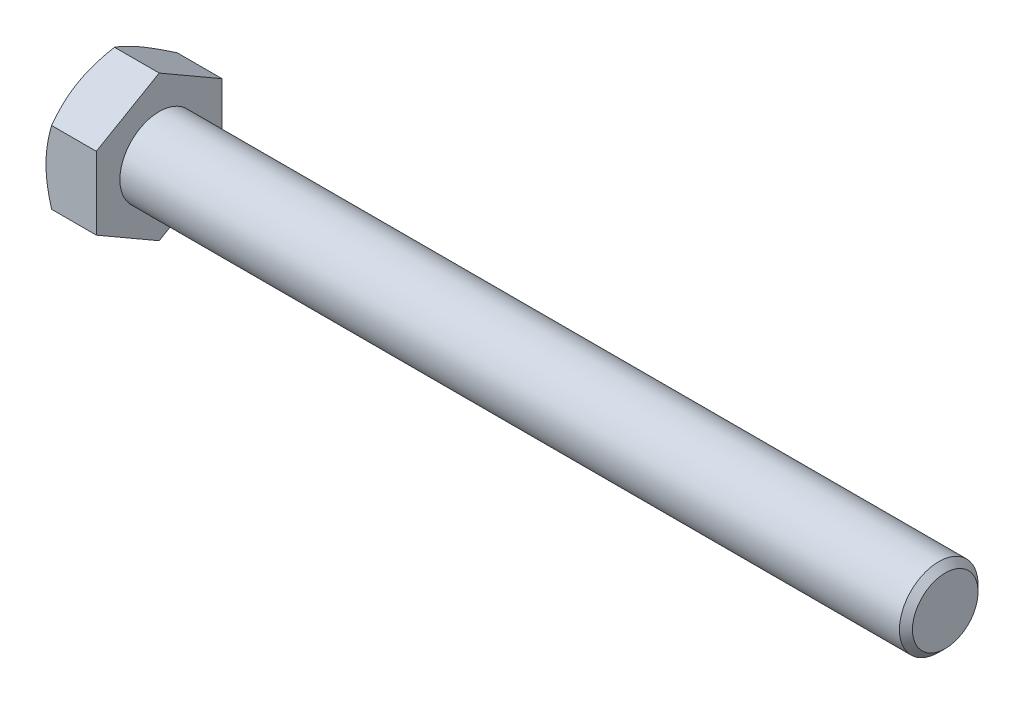
ISO-10303-21;
HEADER;
FILE_DESCRIPTION(('STEP AP214'),'2;1');
FILE_NAME('part.step','',(''),(''),'','','');
FILE_SCHEMA(('AUTOMOTIVE_DESIGN { 1 0 10303 214 1 1 1 1 }'));
ENDSEC;
DATA;
#1=APPLICATION_CONTEXT('core data for automotive mechanical design processes');
#2=APPLICATION_PROTOCOL_DEFINITION('international standard','automotive_design',2000,#1);
#3=PRODUCT_CONTEXT('',#1,'mechanical');
#4=PRODUCT('Part','Part','',(#3));
#5=PRODUCT_RELATED_PRODUCT_CATEGORY('part','',(#4));
#6=PRODUCT_DEFINITION_FORMATION('','',#4);
#7=PRODUCT_DEFINITION_CONTEXT('part definition',#1,'design');
#8=PRODUCT_DEFINITION('design','',#6,#7);
#9=PRODUCT_DEFINITION_SHAPE('','',#8);
#10=(LENGTH_UNIT() NAMED_UNIT(*) SI_UNIT(.MILLI.,.METRE.));
#11=(NAMED_UNIT(*) PLANE_ANGLE_UNIT() SI_UNIT($,.RADIAN.));
#12=(NAMED_UNIT(*) SI_UNIT($,.STERADIAN.) SOLID_ANGLE_UNIT());
#13=UNCERTAINTY_MEASURE_WITH_UNIT(LENGTH_MEASURE(1.E-05),#10,'distance_accuracy_value','');
#14=(GEOMETRIC_REPRESENTATION_CONTEXT(3) GLOBAL_UNCERTAINTY_ASSIGNED_CONTEXT((#13)) GLOBAL_UNIT_ASSIGNED_CONTEXT((#10,
#11,#12)) REPRESENTATION_CONTEXT('',''));
#15=CARTESIAN_POINT('',(0.,0.,0.));
#16=DIRECTION('',(0.,0.,1.));
#17=DIRECTION('',(1.,0.,0.));
#18=AXIS2_PLACEMENT_3D('',#15,#16,#17);
#19=CARTESIAN_POINT('',(6.4,4.61880215351702,-8.00000000000003));
#20=DIRECTION('',(0.,-0.866025403784488,0.500000000000026));
#21=DIRECTION('',(0.,-0.500000000000026,-0.866025403784488));
#22=AXIS2_PLACEMENT_3D('',#19,#20,#21);
#23=PLANE('',#22);
#24=CARTESIAN_POINT('',(0.714597847732978,9.23771977708802,0.000200000000016159));
#25=CARTESIAN_POINT('',(0.655990714047322,9.13619343437823,-0.175648783879834));
#26=CARTESIAN_POINT('',(0.600043401047323,9.03428856550545,-0.352153194306047));
#27=CARTESIAN_POINT('',(0.494201005024707,8.82965122633303,-0.706595462878343));
#28=CARTESIAN_POINT('',(0.444308534431106,8.7269184190524,-0.884533904692592));
#29=CARTESIAN_POINT('',(0.304692797206904,8.41707512197086,-1.42119823762251));
#30=CARTESIAN_POINT('',(0.225281170978407,8.20874154247295,-1.78204258223557));
#31=CARTESIAN_POINT('',(0.132161646294525,7.89697436704796,-2.32203917020387));
#32=CARTESIAN_POINT('',(0.105634581029159,7.79447216638306,-2.49957818964309));
#33=CARTESIAN_POINT('',(0.0611531748589067,7.58900421950661,-2.85545911296));
#34=CARTESIAN_POINT('',(0.0431980765146079,7.48603851506325,-3.03380094449304));
#35=CARTESIAN_POINT('',(0.0163156484918861,7.2799298150353,-3.39079168482336));
#36=CARTESIAN_POINT('',(0.00737807354625047,7.17678715432044,-3.56944001360924));
#37=CARTESIAN_POINT('',(-0.00127769603485956,6.97040655051506,-3.92690170509717));
#38=CARTESIAN_POINT('',(-0.000996175497142624,6.86716861046677,-4.10571506252994));
#39=CARTESIAN_POINT('',(0.00814502526877535,6.67416139438163,-4.44001336701677));
#40=CARTESIAN_POINT('',(0.0158896043673658,6.58437849849747,-4.59552190433847));
#41=CARTESIAN_POINT('',(0.0382011348534187,6.40502298765187,-4.90617476174027));
#42=CARTESIAN_POINT('',(0.0527685461381359,6.31545038727463,-5.06131905655979));
#43=CARTESIAN_POINT('',(0.10636069052752,6.04707935721969,-5.52615131589467));
#44=CARTESIAN_POINT('',(0.155268641669127,5.86875596743386,-5.83501648718158));
#45=CARTESIAN_POINT('',(0.2775394032343,5.51021755801485,-6.4560232287602));
#46=CARTESIAN_POINT('',(0.35142052037599,5.33004829739587,-6.7680855421144));
#47=CARTESIAN_POINT('',(0.51910014125497,4.97239658367402,-7.38755648169474));
#48=CARTESIAN_POINT('',(0.612859260854458,4.79490955046828,-7.69497304089175));
#49=CARTESIAN_POINT('',(0.714597847732978,4.61868668346316,-8.00020000000001));
#50=B_SPLINE_CURVE_WITH_KNOTS('',3,(#24,#25,#26,#27,#28,#29,#30,#31,#32,#33,#34,#35,#36,#37,#38,
#39,#40,#41,#42,#43,#44,#45,#46,#47,#48,#49),.UNSPECIFIED.,.F.,.F.,(4,2,2,2,2,2,2,2,2,2,2,2,4),
(0.,0.633973543721321,1.2682196571435,2.53934712434755,3.15934343977035,3.77928496069767,
4.39852133866747,5.01773858515574,5.55680239410231,6.09590254421134,7.17487077411829,
8.27776850154295,9.37850115249065),.UNSPECIFIED.);
#51=CARTESIAN_POINT('',(0.714531179816333,9.2376043070342,0.));
#52=VERTEX_POINT('',#51);
#53=CARTESIAN_POINT('',(0.,6.92820323027563,-4.00000000000004));
#54=VERTEX_POINT('',#53);
#55=EDGE_CURVE('E54',#52,#54,#50,.T.);
#56=ORIENTED_EDGE('',*,*,#55,.F.);
#57=DIRECTION('',(-1.,0.,0.));
#58=VECTOR('',#57,1.);
#59=CARTESIAN_POINT('',(6.4,9.2376043070342,0.));
#60=LINE('',#59,#58);
#61=CARTESIAN_POINT('',(6.4,9.2376043070342,0.));
#62=VERTEX_POINT('',#61);
#63=EDGE_CURVE('E150',#62,#52,#60,.T.);
#64=ORIENTED_EDGE('',*,*,#63,.F.);
#65=DIRECTION('',(0.,0.500000000000026,0.866025403784488));
#66=VECTOR('',#65,1.);
#67=CARTESIAN_POINT('',(6.4,4.61880215351702,-8.00000000000003));
#68=LINE('',#67,#66);
#69=CARTESIAN_POINT('',(6.4,4.61880215351702,-8.00000000000003));
#70=VERTEX_POINT('',#69);
#71=EDGE_CURVE('E241',#70,#62,#68,.T.);
#72=ORIENTED_EDGE('',*,*,#71,.F.);
#73=DIRECTION('',(-1.,0.,0.));
#74=VECTOR('',#73,1.);
#75=CARTESIAN_POINT('',(6.4,4.61880215351702,-8.00000000000003));
#76=LINE('',#75,#74);
#77=CARTESIAN_POINT('',(0.714531179816319,4.61880215351702,-8.00000000000003));
#78=VERTEX_POINT('',#77);
#79=EDGE_CURVE('E138',#70,#78,#76,.T.);
#80=ORIENTED_EDGE('',*,*,#79,.T.);
#81=EDGE_CURVE('E132',#54,#78,#50,.T.);
#82=ORIENTED_EDGE('',*,*,#81,.F.);
#83=EDGE_LOOP('',(#56,#64,#72,#80,#82));
#84=FACE_BOUND('',#83,.T.);
#85=ADVANCED_FACE('F38',(#84),#23,.F.);
#86=CARTESIAN_POINT('',(6.4,9.2376043070342,0.));
#87=DIRECTION('',(0.,-0.866025403784484,-0.500000000000028));
#88=DIRECTION('',(0.,0.500000000000028,-0.866025403784484));
#89=AXIS2_PLACEMENT_3D('',#86,#87,#88);
#90=PLANE('',#89);
#91=CARTESIAN_POINT('',(0.714597847732978,4.61868668346324,8.00020000000009));
#92=CARTESIAN_POINT('',(0.655990714047357,4.720213026173,7.8243512161202));
#93=CARTESIAN_POINT('',(0.600043401047373,4.82211789504577,7.64784680569397));
#94=CARTESIAN_POINT('',(0.494201005024768,5.02675523421819,7.29340453712165));
#95=CARTESIAN_POINT('',(0.444308534431164,5.12948804149883,7.11546609530739));
#96=CARTESIAN_POINT('',(0.304692797206955,5.43933133858039,6.57880176237745));
#97=CARTESIAN_POINT('',(0.225281170978461,5.64766491807832,6.21795741776437));
#98=CARTESIAN_POINT('',(0.132161646294585,5.95943209350331,5.67796082979604));
#99=CARTESIAN_POINT('',(0.105634581029222,6.06193429416822,5.5004218103568));
#100=CARTESIAN_POINT('',(0.0611531748589704,6.2674022410447,5.14454088703988));
#101=CARTESIAN_POINT('',(0.0431980765146702,6.37036794548807,4.96619905550684));
#102=CARTESIAN_POINT('',(0.0163156484919707,6.576476645516,4.60920831517648));
#103=CARTESIAN_POINT('',(0.00737807354635879,6.67961930623081,4.43055998639057));
#104=CARTESIAN_POINT('',(-0.00127769603479874,6.88599991003635,4.0730982949027));
#105=CARTESIAN_POINT('',(-0.000996175497153047,6.98923785008486,3.89428493747005));
#106=CARTESIAN_POINT('',(0.00814502526878396,7.18224506616996,3.55998663298321));
#107=CARTESIAN_POINT('',(0.0158896043674441,7.27202796205393,3.40447809566142));
#108=CARTESIAN_POINT('',(0.0382011348535523,7.45138347289937,3.09382523825956));
#109=CARTESIAN_POINT('',(0.0527685461382551,7.54095607327665,2.93868094344008));
#110=CARTESIAN_POINT('',(0.106360690527616,7.80932710333165,2.47384868410526));
#111=CARTESIAN_POINT('',(0.155268641669236,7.98765049311744,2.16498351281835));
#112=CARTESIAN_POINT('',(0.277539403234421,8.34618890253641,1.54397677123976));
#113=CARTESIAN_POINT('',(0.351420520376112,8.52635816315538,1.23191445788558));
#114=CARTESIAN_POINT('',(0.51910014125506,8.88400987687721,0.612443518305287));
#115=CARTESIAN_POINT('',(0.612859260854515,9.06149691008294,0.305026959108281));
#116=CARTESIAN_POINT('',(0.714597847732978,9.237719777088,-0.000200000000002282));
#117=B_SPLINE_CURVE_WITH_KNOTS('',3,(#91,#92,#93,#94,#95,#96,#97,#98,#99,#100,#101,#102,#103,
#104,#105,#106,#107,#108,#109,#110,#111,#112,#113,#114,#115,#116),.UNSPECIFIED.,.F.,.F.,(4,2,2,
2,2,2,2,2,2,2,2,2,4),(0.,0.633973543721347,1.26821965714356,2.53934712434767,3.15934343977051,
3.77928496069786,4.39852133866768,5.01773858515598,5.55680239410251,6.09590254421151,
7.17487077411839,8.27776850154299,9.37850115249062),.UNSPECIFIED.);
#118=CARTESIAN_POINT('',(0.714531179816319,4.61880215351702,8.00000000000001));
#119=VERTEX_POINT('',#118);
#120=CARTESIAN_POINT('',(0.,6.92820323027598,4.00000000000026));
#121=VERTEX_POINT('',#120);
#122=EDGE_CURVE('E61',#119,#121,#117,.T.);
#123=ORIENTED_EDGE('',*,*,#122,.F.);
#124=DIRECTION('',(-1.,0.,0.));
#125=VECTOR('',#124,1.);
#126=CARTESIAN_POINT('',(6.4,4.61880215351702,8.00000000000001));
#127=LINE('',#126,#125);
#128=CARTESIAN_POINT('',(6.4,4.61880215351702,8.00000000000001));
#129=VERTEX_POINT('',#128);
#130=EDGE_CURVE('E148',#129,#119,#127,.T.);
#131=ORIENTED_EDGE('',*,*,#130,.F.);
#132=DIRECTION('',(0.,-0.500000000000028,0.866025403784484));
#133=VECTOR('',#132,1.);
#134=CARTESIAN_POINT('',(6.4,9.2376043070342,0.));
#135=LINE('',#134,#133);
#136=EDGE_CURVE('E239',#62,#129,#135,.T.);
#137=ORIENTED_EDGE('',*,*,#136,.F.);
#138=ORIENTED_EDGE('',*,*,#63,.T.);
#139=EDGE_CURVE('E165',#121,#52,#117,.T.);
#140=ORIENTED_EDGE('',*,*,#139,.F.);
#141=EDGE_LOOP('',(#123,#131,#137,#138,#140));
#142=FACE_BOUND('',#141,.T.);
#143=ADVANCED_FACE('F171',(#142),#90,.F.);
#144=CARTESIAN_POINT('',(6.4,4.61880215351702,8.00000000000001));
#145=DIRECTION('',(0.,0.,-1.));
#146=DIRECTION('',(0.,1.,0.));
#147=AXIS2_PLACEMENT_3D('',#144,#145,#146);
#148=PLANE('',#147);
#149=CARTESIAN_POINT('',(4.0249059095589,-12.6546855843618,8.00000000000003));
#150=CARTESIAN_POINT('',(3.85338487375995,-12.303124680023,8.00000000000001));
#151=CARTESIAN_POINT('',(3.68343819387205,-11.9507829192252,8.00000000000001));
#152=CARTESIAN_POINT('',(3.3475742777212,-11.2441233293435,8.00000000000001));
#153=CARTESIAN_POINT('',(3.18165763115455,-10.889805220286,8.00000000000001));
#154=CARTESIAN_POINT('',(2.85395194343771,-10.1770689379399,8.00000000000001));
#155=CARTESIAN_POINT('',(2.69218824963994,-9.81863907172215,8.00000000000001));
#156=CARTESIAN_POINT('',(2.37495726740342,-9.09901412811103,8.00000000000001));
#157=CARTESIAN_POINT('',(2.21948969724237,-8.73781917530425,8.00000000000001));
#158=CARTESIAN_POINT('',(1.91124909611309,-7.99950051377998,8.00000000000001));
#159=CARTESIAN_POINT('',(1.75875676572669,-7.62225899058114,8.00000000000001));
#160=CARTESIAN_POINT('',(1.46472411298911,-6.86345576673944,8.00000000000001));
#161=CARTESIAN_POINT('',(1.32318498461758,-6.4818936002969,8.00000000000001));
#162=CARTESIAN_POINT('',(1.05459432501409,-5.71447512364445,8.00000000000001));
#163=CARTESIAN_POINT('',(0.927515476081576,-5.32862847439955,8.));
#164=CARTESIAN_POINT('',(0.69175721109775,-4.55141880373957,8.00000000000002));
#165=CARTESIAN_POINT('',(0.583072254842113,-4.16005748194273,8.00000000000003));
#166=CARTESIAN_POINT('',(0.389750376844216,-3.37376378274519,8.00000000000003));
#167=CARTESIAN_POINT('',(0.304973724086281,-2.97886668674348,8.00000000000001));
#168=CARTESIAN_POINT('',(0.199275200237237,-2.38273452840881,8.00000000000001));
#169=CARTESIAN_POINT('',(0.167618755709468,-2.18337977711938,8.00000000000001));
#170=CARTESIAN_POINT('',(0.112075358694781,-1.78359737601684,8.00000000000001));
#171=CARTESIAN_POINT('',(0.0881876500546249,-1.58316983255303,8.00000000000001));
#172=CARTESIAN_POINT('',(0.0489706977401242,-1.18423542027824,8.00000000000001));
#173=CARTESIAN_POINT('',(0.0335291730980914,-0.985739637458753,8.00000000000001));
#174=CARTESIAN_POINT('',(0.0110629716488703,-0.588272086946667,8.00000000000001));
#175=CARTESIAN_POINT('',(0.00403814825767829,-0.389300327604078,8.00000000000002));
#176=CARTESIAN_POINT('',(-0.00142584062081234,0.00876221081485285,8.00000000000001));
#177=CARTESIAN_POINT('',(0.000134957676483547,0.207852989385612,8.));
#178=CARTESIAN_POINT('',(0.0118014217876268,0.605786203078696,8.00000000000003));
#179=CARTESIAN_POINT('',(0.0219074673810779,0.804628626769931,8.00000000000006));
#180=CARTESIAN_POINT('',(0.055716537343723,1.27520491378395,8.00000000000008));
#181=CARTESIAN_POINT('',(0.0830672695242175,1.54668291471767,8.00000000000003));
#182=CARTESIAN_POINT('',(0.152259238389084,2.08777092307496,7.99999999999999));
#183=CARTESIAN_POINT('',(0.19410224386367,2.3573806983816,8.00000000000001));
#184=CARTESIAN_POINT('',(0.33916318879976,3.16301774665645,8.00000000000002));
#185=CARTESIAN_POINT('',(0.461891294668998,3.69558688173424,8.00000000000002));
#186=CARTESIAN_POINT('',(0.67658659521309,4.49226053267639,8.00000000000001));
#187=CARTESIAN_POINT('',(0.754301850106163,4.76044512009603,8.00000000000001));
#188=CARTESIAN_POINT('',(0.918275616254571,5.29421544036096,8.00000000000002));
#189=CARTESIAN_POINT('',(1.00453419017728,5.55980115412717,8.00000000000002));
#190=CARTESIAN_POINT('',(1.18417203245494,6.08844836893942,8.00000000000001));
#191=CARTESIAN_POINT('',(1.27754931556258,6.35151055086877,7.99999999999999));
#192=CARTESIAN_POINT('',(1.47027924561327,6.87542420819596,8.00000000000004));
#193=CARTESIAN_POINT('',(1.56963178297477,7.13627572403565,8.00000000000012));
#194=CARTESIAN_POINT('',(1.83061788216801,7.80218874880594,8.00000000000017));
#195=CARTESIAN_POINT('',(1.9958503059141,8.20583800152922,8.00000000000006));
#196=CARTESIAN_POINT('',(2.33560643435587,9.0092209034027,7.99999999999997));
#197=CARTESIAN_POINT('',(2.51013099317434,9.40895418858919,8.));
#198=CARTESIAN_POINT('',(2.86641484762353,10.2053302393422,8.00000000000003));
#199=CARTESIAN_POINT('',(3.04817649203506,10.6019719507731,8.00000000000002));
#200=CARTESIAN_POINT('',(3.41731474780433,11.3926098653438,8.00000000000002));
#201=CARTESIAN_POINT('',(3.60469117417218,11.7866061551198,8.00000000000002));
#202=CARTESIAN_POINT('',(3.98417976786845,12.5730081264138,8.00000000000002));
#203=CARTESIAN_POINT('',(4.17629837893051,12.9654106921402,8.00000000000002));
#204=CARTESIAN_POINT('',(4.56413460673736,13.7484335593554,8.00000000000002));
#205=CARTESIAN_POINT('',(4.7598522474605,14.1390538489482,8.00000000000002));
#206=CARTESIAN_POINT('',(5.15417790496121,14.9187386930106,8.00000000000002));
#207=CARTESIAN_POINT('',(5.35278537052985,15.3078035265804,8.00000000000002));
#208=CARTESIAN_POINT('',(5.75241277357154,16.084692944668,8.00000000000002));
#209=CARTESIAN_POINT('',(5.95343272118972,16.4725175239615,8.00000000000002));
#210=CARTESIAN_POINT('',(6.52023157707977,17.5591699504475,8.00000000000002));
#211=CARTESIAN_POINT('',(6.88826669162706,18.2568207923893,8.00000000000002));
#212=CARTESIAN_POINT('',(7.6291164571684,19.6496204420466,8.00000000000002));
#213=CARTESIAN_POINT('',(8.00193135553034,20.3447691178637,8.00000000000001));
#214=CARTESIAN_POINT('',(8.74998840178841,21.730949342629,8.00000000000004));
#215=CARTESIAN_POINT('',(9.12521929790348,22.4219869677808,8.00000000000007));
#216=CARTESIAN_POINT('',(9.69012625678375,23.4573861735847,8.));
#217=CARTESIAN_POINT('',(9.87876537279123,23.8023143161849,7.99999999999995));
#218=CARTESIAN_POINT('',(10.2566598278914,24.4918321964485,8.00000000000009));
#219=CARTESIAN_POINT('',(10.4459151660092,24.8364219346461,8.00000000000028));
#220=CARTESIAN_POINT('',(10.635441440782,25.18086263222,8.00000000000074));
#221=B_SPLINE_CURVE_WITH_KNOTS('',3,(#149,#150,#151,#152,#153,#154,#155,#156,#157,#158,#159,
#160,#161,#162,#163,#164,#165,#166,#167,#168,#169,#170,#171,#172,#173,#174,#175,#176,#177,#178,
#179,#180,#181,#182,#183,#184,#185,#186,#187,#188,#189,#190,#191,#192,#193,#194,#195,#196,#197,
#198,#199,#200,#201,#202,#203,#204,#205,#206,#207,#208,#209,#210,#211,#212,#213,#214,#215,#216,
#217,#218,#219,#220),.UNSPECIFIED.,.F.,.F.,(4,2,2,2,2,2,2,2,2,2,2,2,2,2,2,2,2,2,2,2,2,2,2,2,2,2,
2,2,2,2,2,2,2,2,2,4),(0.,1.17352534285521,2.34722138025919,3.5268994501017,4.70652467637682,
5.92708317141322,7.14777452944087,8.36612012171141,9.58409809506418,10.7948027119677,
11.4002329189198,12.0056041799732,12.6027191107727,13.1998236421571,13.7969256548694,
14.3940542062035,15.2121538291979,16.0303533369242,17.6675489652004,18.5051258655033,
19.342708910096,20.1800592201864,21.0173941785987,22.3257038346389,23.6341339573732,
24.9429922461249,26.2518074593079,27.5625113626678,28.8732240016867,30.183689828393,
31.4941611678951,33.8604585893135,36.226878971937,38.5858914350297,39.7653150976327,
40.9447368953021),.UNSPECIFIED.);
#222=CARTESIAN_POINT('',(0.714531179816319,-4.61880215351702,8.00000000000004));
#223=VERTEX_POINT('',#222);
#224=CARTESIAN_POINT('',(0.,1.57859836313889E-13,8.00000000000015));
#225=VERTEX_POINT('',#224);
#226=EDGE_CURVE('E251',#223,#225,#221,.T.);
#227=ORIENTED_EDGE('',*,*,#226,.F.);
#228=DIRECTION('',(-1.,0.,0.));
#229=VECTOR('',#228,1.);
#230=CARTESIAN_POINT('',(6.4,-4.61880215351699,8.00000000000002));
#231=LINE('',#230,#229);
#232=CARTESIAN_POINT('',(6.4,-4.61880215351699,8.00000000000002));
#233=VERTEX_POINT('',#232);
#234=EDGE_CURVE('E140',#233,#223,#231,.T.);
#235=ORIENTED_EDGE('',*,*,#234,.F.);
#236=DIRECTION('',(0.,-1.,0.));
#237=VECTOR('',#236,1.);
#238=CARTESIAN_POINT('',(6.4,4.61880215351702,8.00000000000001));
#239=LINE('',#238,#237);
#240=EDGE_CURVE('E235',#129,#233,#239,.T.);
#241=ORIENTED_EDGE('',*,*,#240,.F.);
#242=ORIENTED_EDGE('',*,*,#130,.T.);
#243=EDGE_CURVE('E189',#225,#119,#221,.T.);
#244=ORIENTED_EDGE('',*,*,#243,.F.);
#245=EDGE_LOOP('',(#227,#235,#241,#242,#244));
#246=FACE_BOUND('',#245,.T.);
#247=ADVANCED_FACE('F257',(#246),#148,.F.);
#248=CARTESIAN_POINT('',(6.4,-9.23760430703402,0.));
#249=DIRECTION('',(0.,0.866025403784487,-0.500000000000029));
#250=DIRECTION('',(0.,0.500000000000029,0.866025403784488));
#251=AXIS2_PLACEMENT_3D('',#248,#249,#250);
#252=PLANE('',#251);
#253=CARTESIAN_POINT('',(0.714597847732978,-9.23771977708787,-0.000199999999943301));
#254=CARTESIAN_POINT('',(0.655990714047296,-9.13619343437812,0.175648783879938));
#255=CARTESIAN_POINT('',(0.600043401047286,-9.03428856550537,0.352153194306169));
#256=CARTESIAN_POINT('',(0.494201005024661,-8.82965122633295,0.706595462878487));
#257=CARTESIAN_POINT('',(0.444308534431063,-8.72691841905231,0.884533904692739));
#258=CARTESIAN_POINT('',(0.304692797206865,-8.41707512197075,1.42119823762267));
#259=CARTESIAN_POINT('',(0.225281170978368,-8.20874154247284,1.78204258223574));
#260=CARTESIAN_POINT('',(0.13216164629449,-7.89697436704784,2.32203917020407));
#261=CARTESIAN_POINT('',(0.105634581029126,-7.79447216638294,2.4995781896433));
#262=CARTESIAN_POINT('',(0.0611531748588779,-7.58900421950647,2.85545911296021));
#263=CARTESIAN_POINT('',(0.0431980765145819,-7.4860385150631,3.03380094449325));
#264=CARTESIAN_POINT('',(0.0163156484918686,-7.27992981503516,3.3907916848236));
#265=CARTESIAN_POINT('',(0.00737807354623885,-7.17678715432033,3.5694400136095));
#266=CARTESIAN_POINT('',(-0.00127769603487182,-6.97040655051486,3.92690170509739));
#267=CARTESIAN_POINT('',(-0.00099617549716135,-6.86716861046645,4.1057150625301));
#268=CARTESIAN_POINT('',(0.00814502526876527,-6.67416139438133,4.44001336701694));
#269=CARTESIAN_POINT('',(0.0158896043673674,-6.58437849849728,4.59552190433868));
#270=CARTESIAN_POINT('',(0.0382011348534322,-6.40502298765177,4.9061747617405));
#271=CARTESIAN_POINT('',(0.0527685461381496,-6.31545038727451,5.06131905656));
#272=CARTESIAN_POINT('',(0.106360690527535,-6.04707935721955,5.52615131589483));
#273=CARTESIAN_POINT('',(0.155268641669145,-5.86875596743375,5.83501648718173));
#274=CARTESIAN_POINT('',(0.277539403234317,-5.51021755801477,6.45602322876031));
#275=CARTESIAN_POINT('',(0.351420520376004,-5.3300482973958,6.76808554211449));
#276=CARTESIAN_POINT('',(0.519100141254974,-4.97239658367397,7.38755648169478));
#277=CARTESIAN_POINT('',(0.612859260854454,-4.79490955046824,7.69497304089178));
#278=CARTESIAN_POINT('',(0.714597847732965,-4.61868668346316,8.00020000000003));
#279=B_SPLINE_CURVE_WITH_KNOTS('',3,(#253,#254,#255,#256,#257,#258,#259,#260,#261,#262,#263,
#264,#265,#266,#267,#268,#269,#270,#271,#272,#273,#274,#275,#276,#277,#278),.UNSPECIFIED.,.F.,
.F.,(4,2,2,2,2,2,2,2,2,2,2,2,4),(0.,0.633973543721345,1.26821965714355,2.53934712434764,
3.15934343977046,3.7792849606978,4.39852133866762,5.01773858515591,5.55680239410244,
6.09590254421144,7.17487077411832,8.2777685015429,9.37850115249053),.UNSPECIFIED.);
#280=CARTESIAN_POINT('',(0.714531179816319,-9.23760430703402,0.));
#281=VERTEX_POINT('',#280);
#282=CARTESIAN_POINT('',(0.,-6.92820323027558,4.00000000000004));
#283=VERTEX_POINT('',#282);
#284=EDGE_CURVE('E173',#281,#283,#279,.T.);
#285=ORIENTED_EDGE('',*,*,#284,.F.);
#286=DIRECTION('',(-1.,0.,0.));
#287=VECTOR('',#286,1.);
#288=CARTESIAN_POINT('',(6.4,-9.23760430703402,0.));
#289=LINE('',#288,#287);
#290=CARTESIAN_POINT('',(6.4,-9.23760430703402,0.));
#291=VERTEX_POINT('',#290);
#292=EDGE_CURVE('E137',#291,#281,#289,.T.);
#293=ORIENTED_EDGE('',*,*,#292,.F.);
#294=DIRECTION('',(0.,-0.500000000000028,-0.866025403784487));
#295=VECTOR('',#294,1.);
#296=CARTESIAN_POINT('',(6.4,-9.23760430703402,0.));
#297=LINE('',#296,#295);
#298=EDGE_CURVE('E233',#233,#291,#297,.T.);
#299=ORIENTED_EDGE('',*,*,#298,.F.);
#300=ORIENTED_EDGE('',*,*,#234,.T.);
#301=EDGE_CURVE('E175',#283,#223,#279,.T.);
#302=ORIENTED_EDGE('',*,*,#301,.F.);
#303=EDGE_LOOP('',(#285,#293,#299,#300,#302));
#304=FACE_BOUND('',#303,.T.);
#305=ADVANCED_FACE('F229',(#304),#252,.F.);
#306=CARTESIAN_POINT('',(6.4,-4.61880215351704,-8.00000000000004));
#307=DIRECTION('',(0.,0.866025403784482,0.500000000000025));
#308=DIRECTION('',(0.,-0.500000000000025,0.866025403784482));
#309=AXIS2_PLACEMENT_3D('',#306,#307,#308);
#310=PLANE('',#309);
#311=CARTESIAN_POINT('',(0.714597847732978,-4.61868668346319,-8.00020000000007));
#312=CARTESIAN_POINT('',(0.655990714047322,-4.72021302617291,-7.82435121612017));
#313=CARTESIAN_POINT('',(0.600043401047321,-4.82211789504566,-7.64784680569392));
#314=CARTESIAN_POINT('',(0.494201005024702,-5.02675523421807,-7.29340453712159));
#315=CARTESIAN_POINT('',(0.4443085344311,-5.12948804149871,-7.11546609530734));
#316=CARTESIAN_POINT('',(0.304692797206893,-5.43933133858028,-6.57880176237741));
#317=CARTESIAN_POINT('',(0.225281170978395,-5.6476649180782,-6.21795741776432));
#318=CARTESIAN_POINT('',(0.132161646294516,-5.9594320935032,-5.67796082979599));
#319=CARTESIAN_POINT('',(0.105634581029152,-6.0619342941681,-5.50042181035675));
#320=CARTESIAN_POINT('',(0.0611531748589019,-6.26740224104458,-5.14454088703983));
#321=CARTESIAN_POINT('',(0.0431980765146045,-6.37036794548795,-4.96619905550679));
#322=CARTESIAN_POINT('',(0.0163156484918925,-6.57647664551589,-4.60920831517643));
#323=CARTESIAN_POINT('',(0.00737807354626524,-6.67961930623072,-4.43055998639053));
#324=CARTESIAN_POINT('',(-0.00127769603485095,-6.88599991003621,-4.07309829490263));
#325=CARTESIAN_POINT('',(-0.000996175497148478,-6.98923785008465,-3.89428493746994));
#326=CARTESIAN_POINT('',(0.00814502526877989,-7.18224506616977,-3.5599866329831));
#327=CARTESIAN_POINT('',(0.0158896043673894,-7.27202796205379,-3.40447809566135));
#328=CARTESIAN_POINT('',(0.0382011348534588,-7.45138347289928,-3.09382523825952));
#329=CARTESIAN_POINT('',(0.0527685461381735,-7.54095607327654,-2.93868094344003));
#330=CARTESIAN_POINT('',(0.106360690527555,-7.80932710333152,-2.4738486841052));
#331=CARTESIAN_POINT('',(0.155268641669166,-7.98765049311731,-2.1649835128183));
#332=CARTESIAN_POINT('',(0.277539403234339,-8.34618890253628,-1.54397677123973));
#333=CARTESIAN_POINT('',(0.351420520376024,-8.52635816315525,-1.23191445788555));
#334=CARTESIAN_POINT('',(0.51910014125499,-8.88400987687707,-0.612443518305262));
#335=CARTESIAN_POINT('',(0.612859260854468,-9.0614969100828,-0.305026959108265));
#336=CARTESIAN_POINT('',(0.714597847732978,-9.23771977708786,0.000199999999995343));
#337=B_SPLINE_CURVE_WITH_KNOTS('',3,(#311,#312,#313,#314,#315,#316,#317,#318,#319,#320,#321,
#322,#323,#324,#325,#326,#327,#328,#329,#330,#331,#332,#333,#334,#335,#336),.UNSPECIFIED.,.F.,
.F.,(4,2,2,2,2,2,2,2,2,2,2,2,4),(0.,0.633973543721355,1.26821965714357,2.53934712434768,
3.15934343977052,3.77928496069788,4.3985213386677,5.017738585156,5.55680239410253,
6.09590254421152,7.17487077411839,8.27776850154297,9.37850115249059),.UNSPECIFIED.);
#338=CARTESIAN_POINT('',(0.714531179816166,-4.61880215351727,-8.00000000000004));
#339=VERTEX_POINT('',#338);
#340=CARTESIAN_POINT('',(0.,-6.92820323027553,-4.00000000000001));
#341=VERTEX_POINT('',#340);
#342=EDGE_CURVE('E114',#339,#341,#337,.T.);
#343=ORIENTED_EDGE('',*,*,#342,.F.);
#344=DIRECTION('',(-1.,0.,0.));
#345=VECTOR('',#344,1.);
#346=CARTESIAN_POINT('',(6.4,-4.61880215351704,-8.00000000000004));
#347=LINE('',#346,#345);
#348=CARTESIAN_POINT('',(6.4,-4.61880215351704,-8.00000000000004));
#349=VERTEX_POINT('',#348);
#350=EDGE_CURVE('E128',#349,#339,#347,.T.);
#351=ORIENTED_EDGE('',*,*,#350,.F.);
#352=DIRECTION('',(0.,0.500000000000025,-0.866025403784482));
#353=VECTOR('',#352,1.);
#354=CARTESIAN_POINT('',(6.4,-4.61880215351704,-8.00000000000004));
#355=LINE('',#354,#353);
#356=EDGE_CURVE('E231',#291,#349,#355,.T.);
#357=ORIENTED_EDGE('',*,*,#356,.F.);
#358=ORIENTED_EDGE('',*,*,#292,.T.);
#359=EDGE_CURVE('E131',#341,#281,#337,.T.);
#360=ORIENTED_EDGE('',*,*,#359,.F.);
#361=EDGE_LOOP('',(#343,#351,#357,#358,#360));
#362=FACE_BOUND('',#361,.T.);
#363=ADVANCED_FACE('F126',(#362),#310,.F.);
#364=CARTESIAN_POINT('',(6.4,4.61880215351702,-8.00000000000003));
#365=DIRECTION('',(0.,0.,1.));
#366=DIRECTION('',(0.,-1.,0.));
#367=AXIS2_PLACEMENT_3D('',#364,#365,#366);
#368=PLANE('',#367);
#369=CARTESIAN_POINT('',(4.02490591677331,-12.654685599145,-8.00000000000007));
#370=CARTESIAN_POINT('',(3.85338488067435,-12.3031246943085,-8.00000000000005));
#371=CARTESIAN_POINT('',(3.68343820048662,-11.9507829330127,-8.00000000000004));
#372=CARTESIAN_POINT('',(3.34757428373757,-11.2441233421334,-8.00000000000004));
#373=CARTESIAN_POINT('',(3.18165763687253,-10.8898052325765,-8.00000000000004));
#374=CARTESIAN_POINT('',(2.85395194855882,-10.177068949224,-8.00000000000004));
#375=CARTESIAN_POINT('',(2.69218825446262,-9.81863908249934,-8.00000000000004));
#376=CARTESIAN_POINT('',(2.37495727163407,-9.09901413787104,-8.00000000000004));
#377=CARTESIAN_POINT('',(2.21948970117944,-8.73781918455399,-8.00000000000004));
#378=CARTESIAN_POINT('',(1.91124909945303,-7.99950052196695,-8.00000000000004));
#379=CARTESIAN_POINT('',(1.75875676876381,-7.62225899821525,-8.00000000000004));
#380=CARTESIAN_POINT('',(1.46472411543649,-6.86345577325911,-8.00000000000004));
#381=CARTESIAN_POINT('',(1.32318498677804,-6.48189360625497,-8.00000000000004));
#382=CARTESIAN_POINT('',(1.05459432662763,-5.71447512846898,-8.00000000000003));
#383=CARTESIAN_POINT('',(0.927515477435051,-5.32862847865216,-8.00000000000002));
#384=CARTESIAN_POINT('',(0.69175721197267,-4.55141880683302,-8.00000000000005));
#385=CARTESIAN_POINT('',(0.583072255498522,-4.16005748444894,-8.0000000000001));
#386=CARTESIAN_POINT('',(0.389750377059008,-3.3737637837811,-8.0000000000001));
#387=CARTESIAN_POINT('',(0.304973724094171,-2.97886668689226,-8.00000000000005));
#388=CARTESIAN_POINT('',(0.199275200034097,-2.3827345272108,-8.00000000000003));
#389=CARTESIAN_POINT('',(0.167618755452557,-2.18337977546992,-8.00000000000004));
#390=CARTESIAN_POINT('',(0.112075358367361,-1.78359737346045,-8.00000000000004));
#391=CARTESIAN_POINT('',(0.0881876497104582,-1.58316982954118,-8.00000000000004));
#392=CARTESIAN_POINT('',(0.0489706974028965,-1.18423541636504,-8.00000000000004));
#393=CARTESIAN_POINT('',(0.0335291727837908,-0.985739633099717,-8.00000000000004));
#394=CARTESIAN_POINT('',(0.0110629714200483,-0.588272081696596,-8.00000000000004));
#395=CARTESIAN_POINT('',(0.00403814809140714,-0.389300321908804,-8.00000000000004));
#396=CARTESIAN_POINT('',(-0.00142584062306026,0.00876221739737551,-8.00000000000003));
#397=CARTESIAN_POINT('',(0.000134957775713527,0.20785299641018,-8.00000000000002));
#398=CARTESIAN_POINT('',(0.0118014221261255,0.60578621098172,-8.00000000000005));
#399=CARTESIAN_POINT('',(0.021907467857371,0.804628635109368,-8.00000000000008));
#400=CARTESIAN_POINT('',(0.055716538158753,1.27520492278816,-8.00000000000009));
#401=CARTESIAN_POINT('',(0.0830672705335774,1.54668292394839,-8.00000000000005));
#402=CARTESIAN_POINT('',(0.152259239797354,2.08777093274817,-8.00000000000002));
#403=CARTESIAN_POINT('',(0.194102245476521,2.35738070827079,-8.00000000000003));
#404=CARTESIAN_POINT('',(0.339163191030446,3.16301775718138,-8.00000000000004));
#405=CARTESIAN_POINT('',(0.461891297316765,3.69558689266572,-8.00000000000004));
#406=CARTESIAN_POINT('',(0.676586598475571,4.4922605442156,-8.00000000000003));
#407=CARTESIAN_POINT('',(0.754301853574835,4.7604451318422,-8.00000000000003));
#408=CARTESIAN_POINT('',(0.91827562012905,5.29421545251861,-8.00000000000004));
#409=CARTESIAN_POINT('',(1.00453419425137,5.55980116648933,-8.00000000000004));
#410=CARTESIAN_POINT('',(1.18417203692082,6.08844838170899,-8.00000000000003));
#411=CARTESIAN_POINT('',(1.27754932022062,6.35151056384126,-8.00000000000002));
#412=CARTESIAN_POINT('',(1.47027925064868,6.87542422157427,-8.00000000000005));
#413=CARTESIAN_POINT('',(1.56963178819541,7.13627573761688,-8.00000000000009));
#414=CARTESIAN_POINT('',(1.83061788769923,7.80218876251034,-8.00000000000012));
#415=CARTESIAN_POINT('',(1.99585031155411,8.20583801515896,-8.00000000000005));
#416=CARTESIAN_POINT('',(2.33560644018466,9.00922091689235,-8.00000000000001));
#417=CARTESIAN_POINT('',(2.5101309990831,9.40895420201342,-8.00000000000003));
#418=CARTESIAN_POINT('',(2.86641485367081,10.2053302526424,-8.00000000000004));
#419=CARTESIAN_POINT('',(3.04817649814085,10.6019719640148,-8.00000000000003));
#420=CARTESIAN_POINT('',(3.4173147540116,11.3926098784749,-8.00000000000003));
#421=CARTESIAN_POINT('',(3.60469118042241,11.7866061681987,-8.00000000000003));
#422=CARTESIAN_POINT('',(3.98417977419158,12.5730081393902,-8.00000000000003));
#423=CARTESIAN_POINT('',(4.17629838528352,12.9654107050663,-8.00000000000003));
#424=CARTESIAN_POINT('',(4.56413461314125,13.7484335721849,-8.00000000000003));
#425=CARTESIAN_POINT('',(4.75985225388537,14.1390538617314,-8.00000000000003));
#426=CARTESIAN_POINT('',(5.15417791142149,14.9187387057047,-8.00000000000003));
#427=CARTESIAN_POINT('',(5.35278537700455,15.3078035392318,-8.00000000000003));
#428=CARTESIAN_POINT('',(5.75241278006979,16.0846929572365,-8.00000000000003));
#429=CARTESIAN_POINT('',(5.9534327276971,16.4725175364898,-8.00000000000003));
#430=CARTESIAN_POINT('',(6.52023158363823,17.5591699629258,-8.00000000000003));
#431=CARTESIAN_POINT('',(6.88826669822337,18.2568208048598,-8.00000000000003));
#432=CARTESIAN_POINT('',(7.62911646383208,19.6496204545052,-8.00000000000003));
#433=CARTESIAN_POINT('',(8.00193136222353,20.3447691303184,-8.00000000000002));
#434=CARTESIAN_POINT('',(8.74998840854106,21.7309493550902,-8.00000000000003));
#435=CARTESIAN_POINT('',(9.12521930468612,22.4219869802524,-8.00000000000003));
#436=CARTESIAN_POINT('',(9.69012626360849,23.4573861860737,-8.00000000000002));
#437=CARTESIAN_POINT('',(9.87876537962956,23.80231432868,-8.00000000000001));
#438=CARTESIAN_POINT('',(10.256659834756,24.4918322089563,-8.00000000000004));
#439=CARTESIAN_POINT('',(10.4459151728866,24.8364219471605,-8.00000000000007));
#440=CARTESIAN_POINT('',(10.6354414476718,25.1808626447411,-8.00000000000014));
#441=B_SPLINE_CURVE_WITH_KNOTS('',3,(#369,#370,#371,#372,#373,#374,#375,#376,#377,#378,#379,
#380,#381,#382,#383,#384,#385,#386,#387,#388,#389,#390,#391,#392,#393,#394,#395,#396,#397,#398,
#399,#400,#401,#402,#403,#404,#405,#406,#407,#408,#409,#410,#411,#412,#413,#414,#415,#416,#417,
#418,#419,#420,#421,#422,#423,#424,#425,#426,#427,#428,#429,#430,#431,#432,#433,#434,#435,#436,
#437,#438,#439,#440),.UNSPECIFIED.,.F.,.F.,(4,2,2,2,2,2,2,2,2,2,2,2,2,2,2,2,2,2,2,2,2,2,2,2,2,2,
2,2,2,2,2,2,2,2,2,4),(0.,1.17352534459167,2.34722138373236,3.52689945532928,4.70652468335869,
5.92708318027307,7.14777454017932,8.36612013432258,9.5840981095466,10.794802729176,
11.40023293749,12.005604199905,12.6027191320313,13.1998236647427,13.7969256787822,
14.3940542314437,15.2121538551722,16.0303533636328,17.6675489933806,18.5051258944524,
19.3427089398139,20.180059250671,21.0173942098502,22.3257038658078,23.6341339884587,
24.9429922771242,26.2518074902214,27.5625113934853,28.8732240324082,30.1836898590202,
31.4941611984278,33.8604586198785,36.2268790025334,38.5858914656965,39.7653151283353,
40.9447369260404),.UNSPECIFIED.);
#442=CARTESIAN_POINT('',(0.,0.,-8.00000000000009));
#443=VERTEX_POINT('',#442);
#444=EDGE_CURVE('E120',#78,#443,#441,.F.);
#445=ORIENTED_EDGE('',*,*,#444,.F.);
#446=ORIENTED_EDGE('',*,*,#79,.F.);
#447=DIRECTION('',(0.,1.,0.));
#448=VECTOR('',#447,1.);
#449=CARTESIAN_POINT('',(6.4,4.61880215351702,-8.00000000000003));
#450=LINE('',#449,#448);
#451=EDGE_CURVE('E136',#349,#70,#450,.T.);
#452=ORIENTED_EDGE('',*,*,#451,.F.);
#453=ORIENTED_EDGE('',*,*,#350,.T.);
#454=EDGE_CURVE('E111',#443,#339,#441,.F.);
#455=ORIENTED_EDGE('',*,*,#454,.F.);
#456=EDGE_LOOP('',(#445,#446,#452,#453,#455));
#457=FACE_BOUND('',#456,.T.);
#458=ADVANCED_FACE('F134',(#457),#368,.F.);
#459=CARTESIAN_POINT('',(6.4,9.2376043070342,0.));
#460=DIRECTION('',(1.,0.,0.));
#461=DIRECTION('',(0.,0.,-1.));
#462=AXIS2_PLACEMENT_3D('',#459,#460,#461);
#463=PLANE('',#462);
#464=ORIENTED_EDGE('',*,*,#71,.T.);
#465=ORIENTED_EDGE('',*,*,#136,.T.);
#466=ORIENTED_EDGE('',*,*,#240,.T.);
#467=ORIENTED_EDGE('',*,*,#298,.T.);
#468=ORIENTED_EDGE('',*,*,#356,.T.);
#469=ORIENTED_EDGE('',*,*,#451,.T.);
#470=EDGE_LOOP('',(#464,#465,#466,#467,#468,#469));
#471=FACE_BOUND('',#470,.T.);
#472=CARTESIAN_POINT('',(6.4,0.,0.));
#473=DIRECTION('',(1.,0.,0.));
#474=DIRECTION('',(0.,0.,-1.));
#475=AXIS2_PLACEMENT_3D('',#472,#473,#474);
#476=CIRCLE('',#475,5.);
#477=CARTESIAN_POINT('',(6.4,0.,-5.00000000000002));
#478=VERTEX_POINT('',#477);
#479=EDGE_CURVE('E244',#478,#478,#476,.F.);
#480=ORIENTED_EDGE('',*,*,#479,.T.);
#481=EDGE_LOOP('',(#480));
#482=FACE_BOUND('',#481,.T.);
#483=ADVANCED_FACE('F259',(#471,#482),#463,.T.);
#484=CARTESIAN_POINT('',(0.,0.,0.));
#485=DIRECTION('',(-1.,0.,0.));
#486=DIRECTION('',(0.,0.,1.));
#487=AXIS2_PLACEMENT_3D('',#484,#485,#486);
#488=CYLINDRICAL_SURFACE('',#487,5.);
#489=ORIENTED_EDGE('',*,*,#479,.F.);
#490=EDGE_LOOP('',(#489));
#491=FACE_BOUND('',#490,.T.);
#492=CARTESIAN_POINT('',(105.572,0.,0.));
#493=DIRECTION('',(-1.,0.,0.));
#494=DIRECTION('',(0.,0.,1.));
#495=AXIS2_PLACEMENT_3D('',#492,#493,#494);
#496=CIRCLE('',#495,5.);
#497=CARTESIAN_POINT('',(105.572,0.,5.00000000000002));
#498=VERTEX_POINT('',#497);
#499=EDGE_CURVE('E247',#498,#498,#496,.T.);
#500=ORIENTED_EDGE('',*,*,#499,.T.);
#501=EDGE_LOOP('',(#500));
#502=FACE_BOUND('',#501,.T.);
#503=ADVANCED_FACE('F291',(#491,#502),#488,.T.);
#504=CARTESIAN_POINT('',(106.4,0.,0.));
#505=DIRECTION('',(-1.,0.,0.));
#506=DIRECTION('',(0.,0.,1.));
#507=AXIS2_PLACEMENT_3D('',#504,#505,#506);
#508=CONICAL_SURFACE('',#507,4.172,0.785398163397443);
#509=ORIENTED_EDGE('',*,*,#499,.F.);
#510=EDGE_LOOP('',(#509));
#511=FACE_BOUND('',#510,.T.);
#512=CARTESIAN_POINT('',(106.4,0.,0.));
#513=DIRECTION('',(-1.,0.,0.));
#514=DIRECTION('',(0.,0.,1.));
#515=AXIS2_PLACEMENT_3D('',#512,#513,#514);
#516=CIRCLE('',#515,4.172);
#517=CARTESIAN_POINT('',(106.4,0.,4.17200000000001));
#518=VERTEX_POINT('',#517);
#519=EDGE_CURVE('E249',#518,#518,#516,.T.);
#520=ORIENTED_EDGE('',*,*,#519,.T.);
#521=EDGE_LOOP('',(#520));
#522=FACE_BOUND('',#521,.T.);
#523=ADVANCED_FACE('F293',(#511,#522),#508,.T.);
#524=CARTESIAN_POINT('',(106.4,0.,0.));
#525=DIRECTION('',(-1.,0.,0.));
#526=DIRECTION('',(0.,0.,1.));
#527=AXIS2_PLACEMENT_3D('',#524,#525,#526);
#528=PLANE('',#527);
#529=ORIENTED_EDGE('',*,*,#519,.F.);
#530=EDGE_LOOP('',(#529));
#531=FACE_BOUND('',#530,.T.);
#532=ADVANCED_FACE('F203',(#531),#528,.F.);
#533=CARTESIAN_POINT('',(0.,0.,0.));
#534=DIRECTION('',(1.,0.,0.));
#535=DIRECTION('',(0.,0.,-1.));
#536=AXIS2_PLACEMENT_3D('',#533,#534,#535);
#537=CONICAL_SURFACE('',#536,8.,1.0471975511966);
#538=ORIENTED_EDGE('',*,*,#342,.T.);
#539=CARTESIAN_POINT('',(0.,0.,0.));
#540=DIRECTION('',(1.,0.,0.));
#541=DIRECTION('',(0.,0.,-1.));
#542=AXIS2_PLACEMENT_3D('',#539,#540,#541);
#543=CIRCLE('',#542,8.);
#544=EDGE_CURVE('E42',#341,#443,#543,.T.);
#545=ORIENTED_EDGE('',*,*,#544,.T.);
#546=ORIENTED_EDGE('',*,*,#454,.T.);
#547=EDGE_LOOP('',(#538,#545,#546));
#548=FACE_BOUND('',#547,.T.);
#549=ADVANCED_FACE('F113',(#548),#537,.T.);
#550=ORIENTED_EDGE('',*,*,#284,.T.);
#551=EDGE_CURVE('E155',#283,#341,#543,.T.);
#552=ORIENTED_EDGE('',*,*,#551,.T.);
#553=ORIENTED_EDGE('',*,*,#359,.T.);
#554=EDGE_LOOP('',(#550,#552,#553));
#555=FACE_BOUND('',#554,.T.);
#556=ADVANCED_FACE('F202',(#555),#537,.T.);
#557=ORIENTED_EDGE('',*,*,#226,.T.);
#558=EDGE_CURVE('E156',#225,#283,#543,.T.);
#559=ORIENTED_EDGE('',*,*,#558,.T.);
#560=ORIENTED_EDGE('',*,*,#301,.T.);
#561=EDGE_LOOP('',(#557,#559,#560));
#562=FACE_BOUND('',#561,.T.);
#563=ADVANCED_FACE('F197',(#562),#537,.T.);
#564=ORIENTED_EDGE('',*,*,#243,.T.);
#565=ORIENTED_EDGE('',*,*,#122,.T.);
#566=CARTESIAN_POINT('',(0.,0.,0.));
#567=DIRECTION('',(-1.,0.,0.));
#568=DIRECTION('',(0.,0.,1.));
#569=AXIS2_PLACEMENT_3D('',#566,#567,#568);
#570=CIRCLE('',#569,8.);
#571=EDGE_CURVE('E121',#225,#121,#570,.T.);
#572=ORIENTED_EDGE('',*,*,#571,.F.);
#573=EDGE_LOOP('',(#564,#565,#572));
#574=FACE_BOUND('',#573,.T.);
#575=ADVANCED_FACE('F201',(#574),#537,.T.);
#576=ORIENTED_EDGE('',*,*,#139,.T.);
#577=ORIENTED_EDGE('',*,*,#55,.T.);
#578=EDGE_CURVE('E47',#54,#121,#543,.T.);
#579=ORIENTED_EDGE('',*,*,#578,.T.);
#580=EDGE_LOOP('',(#576,#577,#579));
#581=FACE_BOUND('',#580,.T.);
#582=ADVANCED_FACE('F164',(#581),#537,.T.);
#583=ORIENTED_EDGE('',*,*,#81,.T.);
#584=ORIENTED_EDGE('',*,*,#444,.T.);
#585=EDGE_CURVE('E11',#443,#54,#543,.T.);
#586=ORIENTED_EDGE('',*,*,#585,.T.);
#587=EDGE_LOOP('',(#583,#584,#586));
#588=FACE_BOUND('',#587,.T.);
#589=ADVANCED_FACE('F263',(#588),#537,.T.);
#590=CARTESIAN_POINT('',(0.,9.2376043070342,0.));
#591=DIRECTION('',(1.,0.,0.));
#592=DIRECTION('',(0.,0.,-1.));
#593=AXIS2_PLACEMENT_3D('',#590,#591,#592);
#594=PLANE('',#593);
#595=ORIENTED_EDGE('',*,*,#585,.F.);
#596=ORIENTED_EDGE('',*,*,#544,.F.);
#597=ORIENTED_EDGE('',*,*,#551,.F.);
#598=ORIENTED_EDGE('',*,*,#558,.F.);
#599=ORIENTED_EDGE('',*,*,#571,.T.);
#600=ORIENTED_EDGE('',*,*,#578,.F.);
#601=EDGE_LOOP('',(#595,#596,#597,#598,#599,#600));
#602=FACE_BOUND('',#601,.T.);
#603=ADVANCED_FACE('F168',(#602),#594,.F.);
#604=CLOSED_SHELL('',(#85,#143,#247,#305,#363,#458,#483,#503,#523,#532,#549,#556,#563,#575,#582,
#589,#603));
#605=MANIFOLD_SOLID_BREP('B2',#604);
#606=ADVANCED_BREP_SHAPE_REPRESENTATION('',(#18,#605),#14);
#607=SHAPE_DEFINITION_REPRESENTATION(#9,#606);
ENDSEC;
END-ISO-10303-21;
